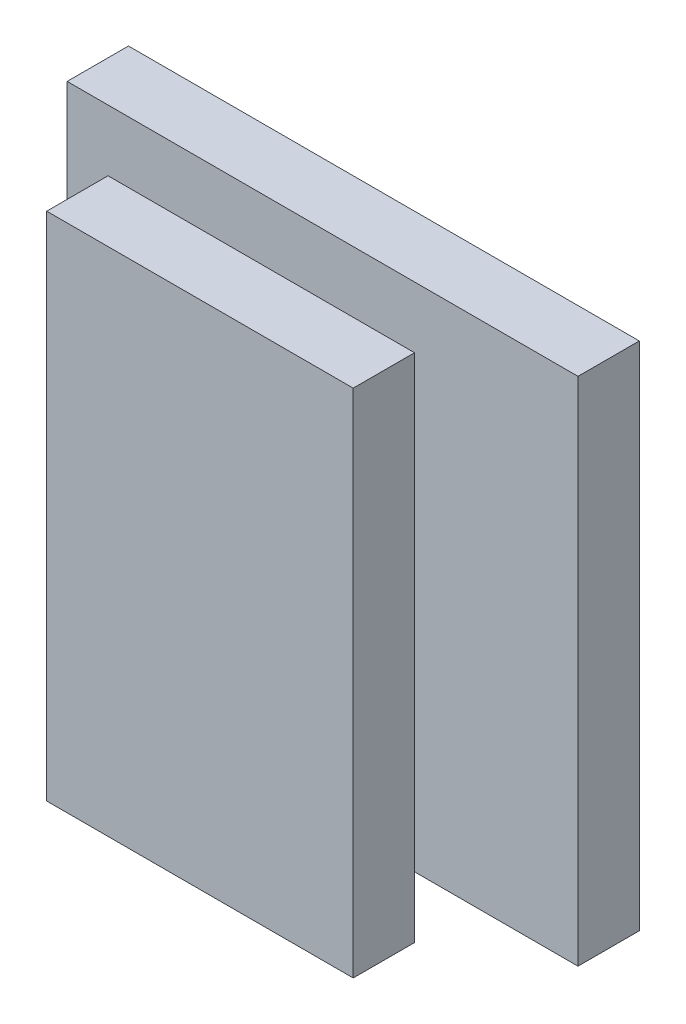
ISO-10303-21;
HEADER;
FILE_DESCRIPTION(('STEP AP214'),'2;1');
FILE_NAME('part.step','',(''),(''),'','','');
FILE_SCHEMA(('AUTOMOTIVE_DESIGN { 1 0 10303 214 1 1 1 1 }'));
ENDSEC;
DATA;
#1=APPLICATION_CONTEXT('core data for automotive mechanical design processes');
#2=APPLICATION_PROTOCOL_DEFINITION('international standard','automotive_design',2000,#1);
#3=PRODUCT_CONTEXT('',#1,'mechanical');
#4=PRODUCT('Part','Part','',(#3));
#5=PRODUCT_RELATED_PRODUCT_CATEGORY('part','',(#4));
#6=PRODUCT_DEFINITION_FORMATION('','',#4);
#7=PRODUCT_DEFINITION_CONTEXT('part definition',#1,'design');
#8=PRODUCT_DEFINITION('design','',#6,#7);
#9=PRODUCT_DEFINITION_SHAPE('','',#8);
#10=(LENGTH_UNIT() NAMED_UNIT(*) SI_UNIT(.MILLI.,.METRE.));
#11=(NAMED_UNIT(*) PLANE_ANGLE_UNIT() SI_UNIT($,.RADIAN.));
#12=(NAMED_UNIT(*) SI_UNIT($,.STERADIAN.) SOLID_ANGLE_UNIT());
#13=UNCERTAINTY_MEASURE_WITH_UNIT(LENGTH_MEASURE(1.E-05),#10,'distance_accuracy_value','');
#14=(GEOMETRIC_REPRESENTATION_CONTEXT(3) GLOBAL_UNCERTAINTY_ASSIGNED_CONTEXT((#13)) GLOBAL_UNIT_ASSIGNED_CONTEXT((#10,
#11,#12)) REPRESENTATION_CONTEXT('',''));
#15=CARTESIAN_POINT('',(0.,0.,0.));
#16=DIRECTION('',(0.,0.,1.));
#17=DIRECTION('',(1.,0.,0.));
#18=AXIS2_PLACEMENT_3D('',#15,#16,#17);
#19=CARTESIAN_POINT('',(-12.5,12.5,3.));
#20=DIRECTION('',(1.,0.,0.));
#21=DIRECTION('',(0.,1.,0.));
#22=AXIS2_PLACEMENT_3D('',#19,#20,#21);
#23=PLANE('',#22);
#24=DIRECTION('',(0.,-1.,0.));
#25=VECTOR('',#24,1.);
#26=CARTESIAN_POINT('',(-12.5,12.5,0.));
#27=LINE('',#26,#25);
#28=CARTESIAN_POINT('',(-12.5,12.5,0.));
#29=VERTEX_POINT('',#28);
#30=CARTESIAN_POINT('',(-12.5,-12.5,0.));
#31=VERTEX_POINT('',#30);
#32=EDGE_CURVE('E157',#29,#31,#27,.T.);
#33=ORIENTED_EDGE('',*,*,#32,.T.);
#34=DIRECTION('',(0.,0.,-1.));
#35=VECTOR('',#34,1.);
#36=CARTESIAN_POINT('',(-12.5,-12.5,3.));
#37=LINE('',#36,#35);
#38=CARTESIAN_POINT('',(-12.5,-12.5,3.));
#39=VERTEX_POINT('',#38);
#40=EDGE_CURVE('E11',#39,#31,#37,.T.);
#41=ORIENTED_EDGE('',*,*,#40,.F.);
#42=DIRECTION('',(0.,-1.,0.));
#43=VECTOR('',#42,1.);
#44=CARTESIAN_POINT('',(-12.5,12.5,3.));
#45=LINE('',#44,#43);
#46=CARTESIAN_POINT('',(-12.5,12.5,3.));
#47=VERTEX_POINT('',#46);
#48=EDGE_CURVE('E159',#47,#39,#45,.T.);
#49=ORIENTED_EDGE('',*,*,#48,.F.);
#50=DIRECTION('',(0.,0.,-1.));
#51=VECTOR('',#50,1.);
#52=CARTESIAN_POINT('',(-12.5,12.5,3.));
#53=LINE('',#52,#51);
#54=EDGE_CURVE('E169',#47,#29,#53,.T.);
#55=ORIENTED_EDGE('',*,*,#54,.T.);
#56=EDGE_LOOP('',(#33,#41,#49,#55));
#57=FACE_BOUND('',#56,.T.);
#58=ADVANCED_FACE('F41',(#57),#23,.F.);
#59=CARTESIAN_POINT('',(-12.5,-12.5,3.));
#60=DIRECTION('',(0.,1.,0.));
#61=DIRECTION('',(0.,0.,1.));
#62=AXIS2_PLACEMENT_3D('',#59,#60,#61);
#63=PLANE('',#62);
#64=DIRECTION('',(1.,0.,0.));
#65=VECTOR('',#64,1.);
#66=CARTESIAN_POINT('',(-12.5,-12.5,0.));
#67=LINE('',#66,#65);
#68=CARTESIAN_POINT('',(12.5,-12.5,0.));
#69=VERTEX_POINT('',#68);
#70=EDGE_CURVE('E173',#31,#69,#67,.T.);
#71=ORIENTED_EDGE('',*,*,#70,.T.);
#72=DIRECTION('',(0.,0.,-1.));
#73=VECTOR('',#72,1.);
#74=CARTESIAN_POINT('',(12.5,-12.5,3.));
#75=LINE('',#74,#73);
#76=CARTESIAN_POINT('',(12.5,-12.5,3.));
#77=VERTEX_POINT('',#76);
#78=EDGE_CURVE('E50',#77,#69,#75,.T.);
#79=ORIENTED_EDGE('',*,*,#78,.F.);
#80=DIRECTION('',(1.,0.,0.));
#81=VECTOR('',#80,1.);
#82=CARTESIAN_POINT('',(-12.5,-12.5,3.));
#83=LINE('',#82,#81);
#84=EDGE_CURVE('E89',#39,#77,#83,.T.);
#85=ORIENTED_EDGE('',*,*,#84,.F.);
#86=ORIENTED_EDGE('',*,*,#40,.T.);
#87=EDGE_LOOP('',(#71,#79,#85,#86));
#88=FACE_BOUND('',#87,.T.);
#89=ADVANCED_FACE('F203',(#88),#63,.F.);
#90=CARTESIAN_POINT('',(12.5,12.5,3.));
#91=DIRECTION('',(-1.,0.,0.));
#92=DIRECTION('',(0.,0.,1.));
#93=AXIS2_PLACEMENT_3D('',#90,#91,#92);
#94=PLANE('',#93);
#95=DIRECTION('',(0.,1.,0.));
#96=VECTOR('',#95,1.);
#97=CARTESIAN_POINT('',(12.5,12.5,0.));
#98=LINE('',#97,#96);
#99=CARTESIAN_POINT('',(12.5,12.5,0.));
#100=VERTEX_POINT('',#99);
#101=EDGE_CURVE('E76',#69,#100,#98,.T.);
#102=ORIENTED_EDGE('',*,*,#101,.T.);
#103=DIRECTION('',(0.,0.,-1.));
#104=VECTOR('',#103,1.);
#105=CARTESIAN_POINT('',(12.5,12.5,3.));
#106=LINE('',#105,#104);
#107=CARTESIAN_POINT('',(12.5,12.5,3.));
#108=VERTEX_POINT('',#107);
#109=EDGE_CURVE('E182',#108,#100,#106,.T.);
#110=ORIENTED_EDGE('',*,*,#109,.F.);
#111=DIRECTION('',(0.,1.,0.));
#112=VECTOR('',#111,1.);
#113=CARTESIAN_POINT('',(12.5,12.5,3.));
#114=LINE('',#113,#112);
#115=EDGE_CURVE('E164',#77,#108,#114,.T.);
#116=ORIENTED_EDGE('',*,*,#115,.F.);
#117=ORIENTED_EDGE('',*,*,#78,.T.);
#118=EDGE_LOOP('',(#102,#110,#116,#117));
#119=FACE_BOUND('',#118,.T.);
#120=ADVANCED_FACE('F186',(#119),#94,.F.);
#121=CARTESIAN_POINT('',(-12.5,12.5,3.));
#122=DIRECTION('',(0.,-1.,0.));
#123=DIRECTION('',(0.,0.,-1.));
#124=AXIS2_PLACEMENT_3D('',#121,#122,#123);
#125=PLANE('',#124);
#126=DIRECTION('',(-1.,0.,0.));
#127=VECTOR('',#126,1.);
#128=CARTESIAN_POINT('',(-12.5,12.5,0.));
#129=LINE('',#128,#127);
#130=EDGE_CURVE('E82',#100,#29,#129,.T.);
#131=ORIENTED_EDGE('',*,*,#130,.T.);
#132=ORIENTED_EDGE('',*,*,#54,.F.);
#133=DIRECTION('',(-1.,0.,0.));
#134=VECTOR('',#133,1.);
#135=CARTESIAN_POINT('',(-12.5,12.5,3.));
#136=LINE('',#135,#134);
#137=EDGE_CURVE('E58',#108,#47,#136,.T.);
#138=ORIENTED_EDGE('',*,*,#137,.F.);
#139=ORIENTED_EDGE('',*,*,#109,.T.);
#140=EDGE_LOOP('',(#131,#132,#138,#139));
#141=FACE_BOUND('',#140,.T.);
#142=ADVANCED_FACE('F193',(#141),#125,.F.);
#143=CARTESIAN_POINT('',(0.,0.,3.));
#144=DIRECTION('',(0.,0.,1.));
#145=DIRECTION('',(1.,0.,0.));
#146=AXIS2_PLACEMENT_3D('',#143,#144,#145);
#147=PLANE('',#146);
#148=CARTESIAN_POINT('',(0.,0.,3.));
#149=DIRECTION('',(0.,0.,1.));
#150=DIRECTION('',(1.,0.,0.));
#151=AXIS2_PLACEMENT_3D('',#148,#149,#150);
#152=CIRCLE('',#151,1.5);
#153=CARTESIAN_POINT('',(1.5,0.,3.));
#154=VERTEX_POINT('',#153);
#155=EDGE_CURVE('E144',#154,#154,#152,.T.);
#156=ORIENTED_EDGE('',*,*,#155,.F.);
#157=EDGE_LOOP('',(#156));
#158=FACE_BOUND('',#157,.T.);
#159=ORIENTED_EDGE('',*,*,#48,.T.);
#160=ORIENTED_EDGE('',*,*,#84,.T.);
#161=ORIENTED_EDGE('',*,*,#115,.T.);
#162=ORIENTED_EDGE('',*,*,#137,.T.);
#163=EDGE_LOOP('',(#159,#160,#161,#162));
#164=FACE_BOUND('',#163,.T.);
#165=ADVANCED_FACE('F195',(#158,#164),#147,.T.);
#166=CARTESIAN_POINT('',(0.,0.,0.));
#167=DIRECTION('',(0.,0.,1.));
#168=DIRECTION('',(1.,0.,0.));
#169=AXIS2_PLACEMENT_3D('',#166,#167,#168);
#170=PLANE('',#169);
#171=ORIENTED_EDGE('',*,*,#32,.F.);
#172=ORIENTED_EDGE('',*,*,#130,.F.);
#173=ORIENTED_EDGE('',*,*,#101,.F.);
#174=ORIENTED_EDGE('',*,*,#70,.F.);
#175=EDGE_LOOP('',(#171,#172,#173,#174));
#176=FACE_BOUND('',#175,.T.);
#177=ADVANCED_FACE('F189',(#176),#170,.F.);
#178=CARTESIAN_POINT('',(0.,0.,6.));
#179=DIRECTION('',(0.,0.,-1.));
#180=DIRECTION('',(-1.,0.,0.));
#181=AXIS2_PLACEMENT_3D('',#178,#179,#180);
#182=CYLINDRICAL_SURFACE('',#181,1.5);
#183=CARTESIAN_POINT('',(0.,0.,6.));
#184=DIRECTION('',(0.,0.,1.));
#185=DIRECTION('',(1.,0.,0.));
#186=AXIS2_PLACEMENT_3D('',#183,#184,#185);
#187=CIRCLE('',#186,1.5);
#188=CARTESIAN_POINT('',(1.5,0.,6.));
#189=VERTEX_POINT('',#188);
#190=EDGE_CURVE('E149',#189,#189,#187,.T.);
#191=ORIENTED_EDGE('',*,*,#190,.F.);
#192=EDGE_LOOP('',(#191));
#193=FACE_BOUND('',#192,.T.);
#194=ORIENTED_EDGE('',*,*,#155,.T.);
#195=EDGE_LOOP('',(#194));
#196=FACE_BOUND('',#195,.T.);
#197=ADVANCED_FACE('F230',(#193,#196),#182,.T.);
#198=CARTESIAN_POINT('',(-7.5,12.5,9.));
#199=DIRECTION('',(1.,0.,0.));
#200=DIRECTION('',(0.,0.,-1.));
#201=AXIS2_PLACEMENT_3D('',#198,#199,#200);
#202=PLANE('',#201);
#203=DIRECTION('',(0.,-1.,0.));
#204=VECTOR('',#203,1.);
#205=CARTESIAN_POINT('',(-7.5,12.5,6.));
#206=LINE('',#205,#204);
#207=CARTESIAN_POINT('',(-7.5,12.5,6.));
#208=VERTEX_POINT('',#207);
#209=CARTESIAN_POINT('',(-7.5,-12.5,6.));
#210=VERTEX_POINT('',#209);
#211=EDGE_CURVE('E142',#208,#210,#206,.T.);
#212=ORIENTED_EDGE('',*,*,#211,.T.);
#213=DIRECTION('',(0.,0.,-1.));
#214=VECTOR('',#213,1.);
#215=CARTESIAN_POINT('',(-7.5,-12.5,9.));
#216=LINE('',#215,#214);
#217=CARTESIAN_POINT('',(-7.5,-12.5,9.));
#218=VERTEX_POINT('',#217);
#219=EDGE_CURVE('E120',#218,#210,#216,.T.);
#220=ORIENTED_EDGE('',*,*,#219,.F.);
#221=DIRECTION('',(0.,-1.,0.));
#222=VECTOR('',#221,1.);
#223=CARTESIAN_POINT('',(-7.5,12.5,9.));
#224=LINE('',#223,#222);
#225=CARTESIAN_POINT('',(-7.5,12.5,9.));
#226=VERTEX_POINT('',#225);
#227=EDGE_CURVE('E128',#226,#218,#224,.T.);
#228=ORIENTED_EDGE('',*,*,#227,.F.);
#229=DIRECTION('',(0.,0.,-1.));
#230=VECTOR('',#229,1.);
#231=CARTESIAN_POINT('',(-7.5,12.5,9.));
#232=LINE('',#231,#230);
#233=EDGE_CURVE('E318',#226,#208,#232,.T.);
#234=ORIENTED_EDGE('',*,*,#233,.T.);
#235=EDGE_LOOP('',(#212,#220,#228,#234));
#236=FACE_BOUND('',#235,.T.);
#237=ADVANCED_FACE('F140',(#236),#202,.F.);
#238=CARTESIAN_POINT('',(-7.5,-12.5,9.));
#239=DIRECTION('',(0.,1.,0.));
#240=DIRECTION('',(0.,0.,1.));
#241=AXIS2_PLACEMENT_3D('',#238,#239,#240);
#242=PLANE('',#241);
#243=DIRECTION('',(1.,0.,0.));
#244=VECTOR('',#243,1.);
#245=CARTESIAN_POINT('',(-7.5,-12.5,6.));
#246=LINE('',#245,#244);
#247=CARTESIAN_POINT('',(7.5,-12.5,6.));
#248=VERTEX_POINT('',#247);
#249=EDGE_CURVE('E305',#210,#248,#246,.T.);
#250=ORIENTED_EDGE('',*,*,#249,.T.);
#251=DIRECTION('',(0.,0.,-1.));
#252=VECTOR('',#251,1.);
#253=CARTESIAN_POINT('',(7.5,-12.5,9.));
#254=LINE('',#253,#252);
#255=CARTESIAN_POINT('',(7.5,-12.5,9.));
#256=VERTEX_POINT('',#255);
#257=EDGE_CURVE('E123',#256,#248,#254,.T.);
#258=ORIENTED_EDGE('',*,*,#257,.F.);
#259=DIRECTION('',(1.,0.,0.));
#260=VECTOR('',#259,1.);
#261=CARTESIAN_POINT('',(-7.5,-12.5,9.));
#262=LINE('',#261,#260);
#263=EDGE_CURVE('E116',#218,#256,#262,.T.);
#264=ORIENTED_EDGE('',*,*,#263,.F.);
#265=ORIENTED_EDGE('',*,*,#219,.T.);
#266=EDGE_LOOP('',(#250,#258,#264,#265));
#267=FACE_BOUND('',#266,.T.);
#268=ADVANCED_FACE('F118',(#267),#242,.F.);
#269=CARTESIAN_POINT('',(7.5,12.5,9.));
#270=DIRECTION('',(-1.,0.,0.));
#271=DIRECTION('',(0.,-1.,0.));
#272=AXIS2_PLACEMENT_3D('',#269,#270,#271);
#273=PLANE('',#272);
#274=DIRECTION('',(0.,1.,0.));
#275=VECTOR('',#274,1.);
#276=CARTESIAN_POINT('',(7.5,12.5,6.));
#277=LINE('',#276,#275);
#278=CARTESIAN_POINT('',(7.5,12.5,6.));
#279=VERTEX_POINT('',#278);
#280=EDGE_CURVE('E309',#248,#279,#277,.T.);
#281=ORIENTED_EDGE('',*,*,#280,.T.);
#282=DIRECTION('',(0.,0.,-1.));
#283=VECTOR('',#282,1.);
#284=CARTESIAN_POINT('',(7.5,12.5,9.));
#285=LINE('',#284,#283);
#286=CARTESIAN_POINT('',(7.5,12.5,9.));
#287=VERTEX_POINT('',#286);
#288=EDGE_CURVE('E151',#287,#279,#285,.T.);
#289=ORIENTED_EDGE('',*,*,#288,.F.);
#290=DIRECTION('',(0.,1.,0.));
#291=VECTOR('',#290,1.);
#292=CARTESIAN_POINT('',(7.5,12.5,9.));
#293=LINE('',#292,#291);
#294=EDGE_CURVE('E127',#256,#287,#293,.T.);
#295=ORIENTED_EDGE('',*,*,#294,.F.);
#296=ORIENTED_EDGE('',*,*,#257,.T.);
#297=EDGE_LOOP('',(#281,#289,#295,#296));
#298=FACE_BOUND('',#297,.T.);
#299=ADVANCED_FACE('F260',(#298),#273,.F.);
#300=CARTESIAN_POINT('',(-7.5,12.5,9.));
#301=DIRECTION('',(0.,-1.,0.));
#302=DIRECTION('',(0.,0.,-1.));
#303=AXIS2_PLACEMENT_3D('',#300,#301,#302);
#304=PLANE('',#303);
#305=DIRECTION('',(-1.,0.,0.));
#306=VECTOR('',#305,1.);
#307=CARTESIAN_POINT('',(-7.5,12.5,6.));
#308=LINE('',#307,#306);
#309=EDGE_CURVE('E138',#279,#208,#308,.T.);
#310=ORIENTED_EDGE('',*,*,#309,.T.);
#311=ORIENTED_EDGE('',*,*,#233,.F.);
#312=DIRECTION('',(-1.,0.,0.));
#313=VECTOR('',#312,1.);
#314=CARTESIAN_POINT('',(-7.5,12.5,9.));
#315=LINE('',#314,#313);
#316=EDGE_CURVE('E133',#287,#226,#315,.T.);
#317=ORIENTED_EDGE('',*,*,#316,.F.);
#318=ORIENTED_EDGE('',*,*,#288,.T.);
#319=EDGE_LOOP('',(#310,#311,#317,#318));
#320=FACE_BOUND('',#319,.T.);
#321=ADVANCED_FACE('F269',(#320),#304,.F.);
#322=CARTESIAN_POINT('',(0.,0.,9.));
#323=DIRECTION('',(0.,0.,1.));
#324=DIRECTION('',(1.,0.,0.));
#325=AXIS2_PLACEMENT_3D('',#322,#323,#324);
#326=PLANE('',#325);
#327=ORIENTED_EDGE('',*,*,#227,.T.);
#328=ORIENTED_EDGE('',*,*,#263,.T.);
#329=ORIENTED_EDGE('',*,*,#294,.T.);
#330=ORIENTED_EDGE('',*,*,#316,.T.);
#331=EDGE_LOOP('',(#327,#328,#329,#330));
#332=FACE_BOUND('',#331,.T.);
#333=ADVANCED_FACE('F131',(#332),#326,.T.);
#334=CARTESIAN_POINT('',(0.,0.,6.));
#335=DIRECTION('',(0.,0.,1.));
#336=DIRECTION('',(1.,0.,0.));
#337=AXIS2_PLACEMENT_3D('',#334,#335,#336);
#338=PLANE('',#337);
#339=ORIENTED_EDGE('',*,*,#190,.T.);
#340=EDGE_LOOP('',(#339));
#341=FACE_BOUND('',#340,.T.);
#342=ORIENTED_EDGE('',*,*,#211,.F.);
#343=ORIENTED_EDGE('',*,*,#309,.F.);
#344=ORIENTED_EDGE('',*,*,#280,.F.);
#345=ORIENTED_EDGE('',*,*,#249,.F.);
#346=EDGE_LOOP('',(#342,#343,#344,#345));
#347=FACE_BOUND('',#346,.T.);
#348=ADVANCED_FACE('F288',(#341,#347),#338,.F.);
#349=CLOSED_SHELL('',(#58,#89,#120,#142,#165,#177,#197,#237,#268,#299,#321,#333,#348));
#350=MANIFOLD_SOLID_BREP('B2',#349);
#351=ADVANCED_BREP_SHAPE_REPRESENTATION('',(#18,#350),#14);
#352=SHAPE_DEFINITION_REPRESENTATION(#9,#351);
ENDSEC;
END-ISO-10303-21;
